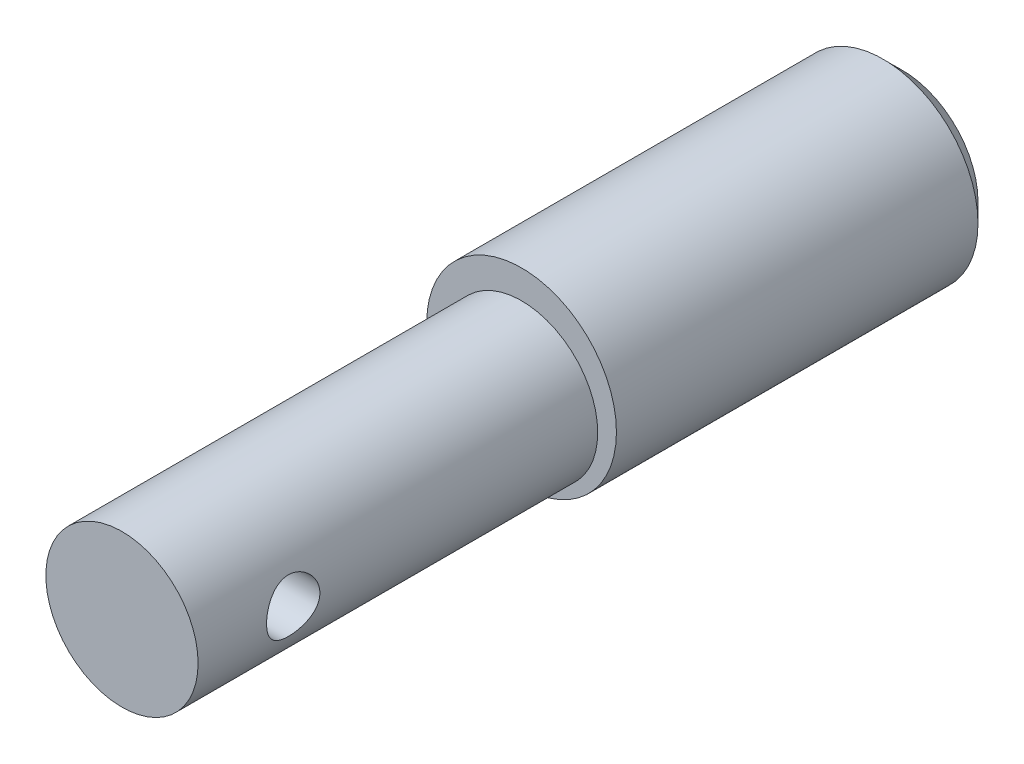
ISO-10303-21;
HEADER;
FILE_DESCRIPTION(('STEP AP214'),'2;1');
FILE_NAME('part.step','',(''),(''),'','','');
FILE_SCHEMA(('AUTOMOTIVE_DESIGN { 1 0 10303 214 1 1 1 1 }'));
ENDSEC;
DATA;
#1=APPLICATION_CONTEXT('core data for automotive mechanical design processes');
#2=APPLICATION_PROTOCOL_DEFINITION('international standard','automotive_design',2000,#1);
#3=PRODUCT_CONTEXT('',#1,'mechanical');
#4=PRODUCT('Part','Part','',(#3));
#5=PRODUCT_RELATED_PRODUCT_CATEGORY('part','',(#4));
#6=PRODUCT_DEFINITION_FORMATION('','',#4);
#7=PRODUCT_DEFINITION_CONTEXT('part definition',#1,'design');
#8=PRODUCT_DEFINITION('design','',#6,#7);
#9=PRODUCT_DEFINITION_SHAPE('','',#8);
#10=(LENGTH_UNIT() NAMED_UNIT(*) SI_UNIT(.MILLI.,.METRE.));
#11=(NAMED_UNIT(*) PLANE_ANGLE_UNIT() SI_UNIT($,.RADIAN.));
#12=(NAMED_UNIT(*) SI_UNIT($,.STERADIAN.) SOLID_ANGLE_UNIT());
#13=UNCERTAINTY_MEASURE_WITH_UNIT(LENGTH_MEASURE(1.E-05),#10,'distance_accuracy_value','');
#14=(GEOMETRIC_REPRESENTATION_CONTEXT(3) GLOBAL_UNCERTAINTY_ASSIGNED_CONTEXT((#13)) GLOBAL_UNIT_ASSIGNED_CONTEXT((#10,
#11,#12)) REPRESENTATION_CONTEXT('',''));
#15=CARTESIAN_POINT('',(0.,0.,0.));
#16=DIRECTION('',(0.,0.,1.));
#17=DIRECTION('',(1.,0.,0.));
#18=AXIS2_PLACEMENT_3D('',#15,#16,#17);
#19=CARTESIAN_POINT('',(0.,0.,16.271875));
#20=DIRECTION('',(0.,0.,-1.));
#21=DIRECTION('',(-1.,0.,0.));
#22=AXIS2_PLACEMENT_3D('',#19,#20,#21);
#23=CYLINDRICAL_SURFACE('',#22,3.95605);
#24=CARTESIAN_POINT('',(0.,0.,-0.396874999999998));
#25=DIRECTION('',(0.,0.,-1.));
#26=DIRECTION('',(-1.,0.,0.));
#27=AXIS2_PLACEMENT_3D('',#24,#25,#26);
#28=CIRCLE('',#27,3.95605);
#29=CARTESIAN_POINT('',(-3.95605,0.,-0.396874999999998));
#30=VERTEX_POINT('',#29);
#31=EDGE_CURVE('E49',#30,#30,#28,.T.);
#32=ORIENTED_EDGE('',*,*,#31,.T.);
#33=EDGE_LOOP('',(#32));
#34=FACE_BOUND('',#33,.T.);
#35=CARTESIAN_POINT('',(0.,0.,-15.478125));
#36=DIRECTION('',(0.,0.,1.));
#37=DIRECTION('',(1.,0.,0.));
#38=AXIS2_PLACEMENT_3D('',#35,#36,#37);
#39=CIRCLE('',#38,3.95605);
#40=CARTESIAN_POINT('',(3.95605,0.,-15.478125));
#41=VERTEX_POINT('',#40);
#42=EDGE_CURVE('E44',#41,#41,#39,.T.);
#43=ORIENTED_EDGE('',*,*,#42,.T.);
#44=EDGE_LOOP('',(#43));
#45=FACE_BOUND('',#44,.T.);
#46=ADVANCED_FACE('F31',(#34,#45),#23,.T.);
#47=CARTESIAN_POINT('',(0.,0.,-16.271875));
#48=DIRECTION('',(0.,0.,1.));
#49=DIRECTION('',(1.,0.,0.));
#50=AXIS2_PLACEMENT_3D('',#47,#48,#49);
#51=PLANE('',#50);
#52=CARTESIAN_POINT('',(0.,0.,-16.271875));
#53=DIRECTION('',(0.,0.,1.));
#54=DIRECTION('',(1.,0.,0.));
#55=AXIS2_PLACEMENT_3D('',#52,#53,#54);
#56=CIRCLE('',#55,3.16229999999999);
#57=CARTESIAN_POINT('',(3.16229999999999,0.,-16.271875));
#58=VERTEX_POINT('',#57);
#59=EDGE_CURVE('E11',#58,#58,#56,.F.);
#60=ORIENTED_EDGE('',*,*,#59,.T.);
#61=EDGE_LOOP('',(#60));
#62=FACE_BOUND('',#61,.T.);
#63=ADVANCED_FACE('F77',(#62),#51,.F.);
#64=CARTESIAN_POINT('',(0.,0.,-15.478125));
#65=DIRECTION('',(0.,0.,1.));
#66=DIRECTION('',(1.,0.,0.));
#67=AXIS2_PLACEMENT_3D('',#64,#65,#66);
#68=CONICAL_SURFACE('',#67,3.95605,0.785398163397446);
#69=ORIENTED_EDGE('',*,*,#59,.F.);
#70=EDGE_LOOP('',(#69));
#71=FACE_BOUND('',#70,.T.);
#72=ORIENTED_EDGE('',*,*,#42,.F.);
#73=EDGE_LOOP('',(#72));
#74=FACE_BOUND('',#73,.T.);
#75=ADVANCED_FACE('F33',(#71,#74),#68,.T.);
#76=CARTESIAN_POINT('',(0.,3.95605,-0.396874999999998));
#77=DIRECTION('',(0.,0.,-1.));
#78=DIRECTION('',(-1.,0.,0.));
#79=AXIS2_PLACEMENT_3D('',#76,#77,#78);
#80=PLANE('',#79);
#81=CARTESIAN_POINT('',(0.,-0.4064,-0.396874999999998));
#82=DIRECTION('',(0.,0.,1.));
#83=DIRECTION('',(1.,0.,0.));
#84=AXIS2_PLACEMENT_3D('',#81,#82,#83);
#85=CIRCLE('',#84,3.175);
#86=CARTESIAN_POINT('',(3.175,-0.4064,-0.396874999999998));
#87=VERTEX_POINT('',#86);
#88=EDGE_CURVE('E54',#87,#87,#85,.T.);
#89=ORIENTED_EDGE('',*,*,#88,.F.);
#90=EDGE_LOOP('',(#89));
#91=FACE_BOUND('',#90,.T.);
#92=ORIENTED_EDGE('',*,*,#31,.F.);
#93=EDGE_LOOP('',(#92));
#94=FACE_BOUND('',#93,.T.);
#95=ADVANCED_FACE('F84',(#91,#94),#80,.F.);
#96=CARTESIAN_POINT('',(0.,-0.4064,13.5155963302752));
#97=DIRECTION('',(0.,0.,1.));
#98=DIRECTION('',(1.,0.,0.));
#99=AXIS2_PLACEMENT_3D('',#96,#97,#98);
#100=CYLINDRICAL_SURFACE('',#99,3.175);
#101=CARTESIAN_POINT('',(3.175,-0.4064,11.1909716417267));
#102=CARTESIAN_POINT('',(3.17500066853554,-0.345895763126236,11.1909706900301));
#103=CARTESIAN_POINT('',(3.17325490135773,-0.285398321888288,11.1959248811373));
#104=CARTESIAN_POINT('',(3.16646357858772,-0.166195926056532,11.215542493183));
#105=CARTESIAN_POINT('',(3.16141801387547,-0.107490976417313,11.2302059409562));
#106=CARTESIAN_POINT('',(3.14857274998259,0.00639074221651198,11.2686703812459));
#107=CARTESIAN_POINT('',(3.14077794084885,0.0615735714813315,11.2924551562864));
#108=CARTESIAN_POINT('',(3.12322210927018,0.167165373662441,11.3484101495663));
#109=CARTESIAN_POINT('',(3.11346063901496,0.217573255469254,11.3805822781041));
#110=CARTESIAN_POINT('',(3.09257883886372,0.314088299969572,11.4536723473957));
#111=CARTESIAN_POINT('',(3.08142355594737,0.359990565416863,11.4948507950993));
#112=CARTESIAN_POINT('',(3.05919544932418,0.44439780767221,11.5842311932265));
#113=CARTESIAN_POINT('',(3.04812264708195,0.482900919429806,11.6324349090882));
#114=CARTESIAN_POINT('',(3.02692009281902,0.552638139965951,11.7364037014277));
#115=CARTESIAN_POINT('',(3.01683242462925,0.583596871413518,11.7923629101067));
#116=CARTESIAN_POINT('',(2.99927864989514,0.635574472042116,11.9091037837688));
#117=CARTESIAN_POINT('',(2.99181164748126,0.656596738838185,11.969883792043));
#118=CARTESIAN_POINT('',(2.98071488097154,0.687319986238264,12.0921981014418));
#119=CARTESIAN_POINT('',(2.9769544277741,0.697407904602637,12.1536229833421));
#120=CARTESIAN_POINT('',(2.97331146441449,0.707186018541611,12.2773998472565));
#121=CARTESIAN_POINT('',(2.97342760400117,0.706879834472287,12.3397514989052));
#122=CARTESIAN_POINT('',(2.97741089672416,0.696177037032629,12.4602211602447));
#123=CARTESIAN_POINT('',(2.98108587213659,0.68629737581093,12.5183925832644));
#124=CARTESIAN_POINT('',(2.99145635682566,0.65757583344791,12.6321928262602));
#125=CARTESIAN_POINT('',(2.99815226346194,0.638732773283885,12.6878213106893));
#126=CARTESIAN_POINT('',(3.01393852560689,0.592302934003713,12.7960829672324));
#127=CARTESIAN_POINT('',(3.02306827229197,0.564570635732072,12.8486477368331));
#128=CARTESIAN_POINT('',(3.04267834881712,0.501250647877553,12.948535696851));
#129=CARTESIAN_POINT('',(3.05315909994304,0.465660505492699,12.9958572436703));
#130=CARTESIAN_POINT('',(3.07503338749543,0.385198701663441,13.08680395219));
#131=CARTESIAN_POINT('',(3.08644459536056,0.339908218982322,13.1300551444113));
#132=CARTESIAN_POINT('',(3.10836554797923,0.242579309556115,13.2084514999779));
#133=CARTESIAN_POINT('',(3.1188751871888,0.190540094543227,13.2435957150747));
#134=CARTESIAN_POINT('',(3.13797296868932,0.0803348976351502,13.3051242062232));
#135=CARTESIAN_POINT('',(3.14653664188425,0.022103117811116,13.331398754021));
#136=CARTESIAN_POINT('',(3.16059865243742,-0.0983269943240249,13.3736594760205));
#137=CARTESIAN_POINT('',(3.16609817064702,-0.160523788302149,13.3896496139525));
#138=CARTESIAN_POINT('',(3.17321186973405,-0.283959706274182,13.4102029988529));
#139=CARTESIAN_POINT('',(3.17499748738957,-0.345105027988882,13.4152708581246));
#140=CARTESIAN_POINT('',(3.17500250538262,-0.467390549143685,13.4152858377261));
#141=CARTESIAN_POINT('',(3.17322257982571,-0.528530747366948,13.4102348711324));
#142=CARTESIAN_POINT('',(3.16640981372192,-0.646987696592213,13.3905491367241));
#143=CARTESIAN_POINT('',(3.1614849432552,-0.704364112994765,13.3762322671257));
#144=CARTESIAN_POINT('',(3.14898536881507,-0.81587100174808,13.338826858442));
#145=CARTESIAN_POINT('',(3.14141032192249,-0.870001052973602,13.3157371841677));
#146=CARTESIAN_POINT('',(3.12411016758225,-0.975153169767657,13.260738130984));
#147=CARTESIAN_POINT('',(3.11433132147319,-1.0260476310071,13.228602187825));
#148=CARTESIAN_POINT('',(3.09372246779125,-1.12188088429613,13.1566846916302));
#149=CARTESIAN_POINT('',(3.08289211132446,-1.16681768779956,13.1169005965967));
#150=CARTESIAN_POINT('',(3.0607046715305,-1.25182272642341,13.0284484672836));
#151=CARTESIAN_POINT('',(3.04934856120297,-1.29153128610349,12.979433661147));
#152=CARTESIAN_POINT('',(3.02793851171742,-1.36221462120816,12.8751987063955));
#153=CARTESIAN_POINT('',(3.0178846189315,-1.39318908565692,12.8199783369305));
#154=CARTESIAN_POINT('',(3.00029780510211,-1.44543921693908,12.7047269191665));
#155=CARTESIAN_POINT('',(2.99276503545936,-1.46671430132451,12.6446955822233));
#156=CARTESIAN_POINT('',(2.98122687812283,-1.49874001613804,12.5215720633924));
#157=CARTESIAN_POINT('',(2.97721967664465,-1.5094960585721,12.4584814730346));
#158=CARTESIAN_POINT('',(2.97340669260579,-1.51973035927989,12.334870459797));
#159=CARTESIAN_POINT('',(2.97337616249277,-1.51981190418432,12.274406417344));
#160=CARTESIAN_POINT('',(2.97695615008998,-1.51020377542791,12.1543752771751));
#161=CARTESIAN_POINT('',(2.9805664053649,-1.50051480604585,12.0948081151244));
#162=CARTESIAN_POINT('',(2.99084566705829,-1.47208569244129,11.9796486931689));
#163=CARTESIAN_POINT('',(2.99744178065524,-1.45356071103845,11.9239962819901));
#164=CARTESIAN_POINT('',(3.01291616766091,-1.40816518651889,11.816549936961));
#165=CARTESIAN_POINT('',(3.02179497852811,-1.3812926776756,11.7647569155089));
#166=CARTESIAN_POINT('',(3.04135727397725,-1.31848553415742,11.6638423998575));
#167=CARTESIAN_POINT('',(3.05210623299341,-1.28218253225696,11.6149629710793));
#168=CARTESIAN_POINT('',(3.07394393087423,-1.20214652478776,11.5237956382067));
#169=CARTESIAN_POINT('',(3.08503276970162,-1.15841131579318,11.4815096960327));
#170=CARTESIAN_POINT('',(3.10689632229082,-1.0624079892394,11.4028142873037));
#171=CARTESIAN_POINT('',(3.11763481297089,-1.00984574836619,11.3667521766732));
#172=CARTESIAN_POINT('',(3.13705096151443,-0.899040865032784,11.3040044738921));
#173=CARTESIAN_POINT('',(3.14572888770729,-0.840798963580377,11.2773176606607));
#174=CARTESIAN_POINT('',(3.15995884246808,-0.720868654991151,11.2344782048477));
#175=CARTESIAN_POINT('',(3.16554201769859,-0.659221721814062,11.2182203300356));
#176=CARTESIAN_POINT('',(3.17306159961663,-0.533846850693776,11.1964694530537));
#177=CARTESIAN_POINT('',(3.174999295936,-0.470119656787345,11.190972644));
#178=CARTESIAN_POINT('',(3.175,-0.4064,11.1909716417267));
#179=B_SPLINE_CURVE_WITH_KNOTS('',3,(#101,#102,#103,#104,#105,#106,#107,#108,#109,#110,#111,
#112,#113,#114,#115,#116,#117,#118,#119,#120,#121,#122,#123,#124,#125,#126,#127,#128,#129,#130,
#131,#132,#133,#134,#135,#136,#137,#138,#139,#140,#141,#142,#143,#144,#145,#146,#147,#148,#149,
#150,#151,#152,#153,#154,#155,#156,#157,#158,#159,#160,#161,#162,#163,#164,#165,#166,#167,#168,
#169,#170,#171,#172,#173,#174,#175,#176,#177,#178),.UNSPECIFIED.,.T.,.F.,(4,2,2,2,2,2,2,2,2,2,2,
2,2,2,2,2,2,2,2,2,2,2,2,2,2,2,2,2,2,2,2,2,2,2,2,2,2,2,4),(0.,0.181278002057098,
0.362556505135639,0.54351418308719,0.724513111908427,0.911675399146183,1.09888480130785,
1.29214909857678,1.48534726432088,1.67145977458031,1.85750746090272,2.03403833726646,
2.21059244047643,2.39019858108119,2.56986086465484,2.75995117641603,2.95006371120354,
3.14244865122902,3.33475939937204,3.51797588705833,3.70115773890124,3.87836604534698,
4.05559729012056,4.23773725061216,4.41993785351354,4.61132433125263,4.80271762241138,
4.99412240522798,5.18542865914298,5.3659179759329,5.54639428361107,5.72268428992002,
5.89901584158409,6.0836838265858,6.26840665591029,6.46139015996397,6.65434851965446,
6.84532788211838,7.03623967063121),.UNSPECIFIED.);
#180=CARTESIAN_POINT('',(3.175,-0.4064,11.1909716417267));
#181=VERTEX_POINT('',#180);
#182=EDGE_CURVE('E35',#181,#181,#179,.T.);
#183=ORIENTED_EDGE('',*,*,#182,.F.);
#184=EDGE_LOOP('',(#183));
#185=FACE_BOUND('',#184,.T.);
#186=CARTESIAN_POINT('',(-3.175,-0.4064,11.1909716417267));
#187=CARTESIAN_POINT('',(-3.17500066853554,-0.466904236873765,11.1909706900301));
#188=CARTESIAN_POINT('',(-3.17325490135773,-0.527401678111713,11.1959248811373));
#189=CARTESIAN_POINT('',(-3.16646357858772,-0.646604073943469,11.215542493183));
#190=CARTESIAN_POINT('',(-3.16141801387547,-0.705309023582687,11.2302059409562));
#191=CARTESIAN_POINT('',(-3.14857274998259,-0.819190742216513,11.2686703812459));
#192=CARTESIAN_POINT('',(-3.14077794084885,-0.874373571481332,11.2924551562864));
#193=CARTESIAN_POINT('',(-3.12322210927018,-0.979965373662442,11.3484101495663));
#194=CARTESIAN_POINT('',(-3.11346063901496,-1.03037325546925,11.3805822781041));
#195=CARTESIAN_POINT('',(-3.09257883886372,-1.12688829996957,11.4536723473957));
#196=CARTESIAN_POINT('',(-3.08142355594737,-1.17279056541686,11.4948507950993));
#197=CARTESIAN_POINT('',(-3.05919544932418,-1.25719780767221,11.5842311932265));
#198=CARTESIAN_POINT('',(-3.04812264708195,-1.29570091942981,11.6324349090882));
#199=CARTESIAN_POINT('',(-3.02692009281902,-1.36543813996595,11.7364037014277));
#200=CARTESIAN_POINT('',(-3.01683242462925,-1.39639687141352,11.7923629101067));
#201=CARTESIAN_POINT('',(-2.99927864989514,-1.44837447204212,11.9091037837688));
#202=CARTESIAN_POINT('',(-2.99181164748126,-1.46939673883819,11.969883792043));
#203=CARTESIAN_POINT('',(-2.98071488097154,-1.50011998623826,12.0921981014418));
#204=CARTESIAN_POINT('',(-2.9769544277741,-1.51020790460264,12.1536229833421));
#205=CARTESIAN_POINT('',(-2.97331146441449,-1.51998601854161,12.2773998472565));
#206=CARTESIAN_POINT('',(-2.97342760400117,-1.51967983447229,12.3397514989052));
#207=CARTESIAN_POINT('',(-2.97741089672416,-1.50897703703263,12.4602211602447));
#208=CARTESIAN_POINT('',(-2.98108587213659,-1.49909737581093,12.5183925832644));
#209=CARTESIAN_POINT('',(-2.99145635682566,-1.47037583344791,12.6321928262602));
#210=CARTESIAN_POINT('',(-2.99815226346194,-1.45153277328389,12.6878213106893));
#211=CARTESIAN_POINT('',(-3.01393852560689,-1.40510293400371,12.7960829672324));
#212=CARTESIAN_POINT('',(-3.02306827229197,-1.37737063573207,12.8486477368331));
#213=CARTESIAN_POINT('',(-3.04267834881712,-1.31405064787755,12.948535696851));
#214=CARTESIAN_POINT('',(-3.05315909994304,-1.2784605054927,12.9958572436703));
#215=CARTESIAN_POINT('',(-3.07503338749543,-1.19799870166344,13.08680395219));
#216=CARTESIAN_POINT('',(-3.08644459536056,-1.15270821898232,13.1300551444113));
#217=CARTESIAN_POINT('',(-3.10836554797923,-1.05537930955612,13.2084514999779));
#218=CARTESIAN_POINT('',(-3.1188751871888,-1.00334009454323,13.2435957150747));
#219=CARTESIAN_POINT('',(-3.13797296868932,-0.893134897635151,13.3051242062232));
#220=CARTESIAN_POINT('',(-3.14653664188425,-0.834903117811116,13.331398754021));
#221=CARTESIAN_POINT('',(-3.16059865243742,-0.714473005675975,13.3736594760205));
#222=CARTESIAN_POINT('',(-3.16609817064702,-0.652276211697851,13.3896496139525));
#223=CARTESIAN_POINT('',(-3.17321186973405,-0.528840293725818,13.4102029988529));
#224=CARTESIAN_POINT('',(-3.17499748738957,-0.467694972011118,13.4152708581246));
#225=CARTESIAN_POINT('',(-3.17500250538262,-0.345409450856315,13.4152858377261));
#226=CARTESIAN_POINT('',(-3.17322257982571,-0.284269252633053,13.4102348711324));
#227=CARTESIAN_POINT('',(-3.16640981372192,-0.165812303407788,13.3905491367241));
#228=CARTESIAN_POINT('',(-3.1614849432552,-0.108435887005236,13.3762322671257));
#229=CARTESIAN_POINT('',(-3.14898536881507,0.00307100174807962,13.338826858442));
#230=CARTESIAN_POINT('',(-3.14141032192249,0.0572010529736009,13.3157371841677));
#231=CARTESIAN_POINT('',(-3.12411016758225,0.162353169767657,13.260738130984));
#232=CARTESIAN_POINT('',(-3.11433132147319,0.213247631007104,13.228602187825));
#233=CARTESIAN_POINT('',(-3.09372246779125,0.309080884296133,13.1566846916302));
#234=CARTESIAN_POINT('',(-3.08289211132446,0.354017687799562,13.1169005965967));
#235=CARTESIAN_POINT('',(-3.0607046715305,0.439022726423405,13.0284484672836));
#236=CARTESIAN_POINT('',(-3.04934856120297,0.478731286103487,12.979433661147));
#237=CARTESIAN_POINT('',(-3.02793851171742,0.549414621208158,12.8751987063955));
#238=CARTESIAN_POINT('',(-3.0178846189315,0.580389085656915,12.8199783369305));
#239=CARTESIAN_POINT('',(-3.00029780510211,0.63263921693908,12.7047269191665));
#240=CARTESIAN_POINT('',(-2.99276503545936,0.653914301324509,12.6446955822233));
#241=CARTESIAN_POINT('',(-2.98122687812283,0.685940016138034,12.5215720633924));
#242=CARTESIAN_POINT('',(-2.97721967664465,0.696696058572104,12.4584814730346));
#243=CARTESIAN_POINT('',(-2.97340669260579,0.706930359279885,12.334870459797));
#244=CARTESIAN_POINT('',(-2.97337616249277,0.707011904184318,12.274406417344));
#245=CARTESIAN_POINT('',(-2.97695615008998,0.697403775427905,12.1543752771751));
#246=CARTESIAN_POINT('',(-2.9805664053649,0.687714806045851,12.0948081151244));
#247=CARTESIAN_POINT('',(-2.99084566705829,0.659285692441288,11.9796486931689));
#248=CARTESIAN_POINT('',(-2.99744178065524,0.64076071103845,11.9239962819901));
#249=CARTESIAN_POINT('',(-3.01291616766091,0.595365186518894,11.816549936961));
#250=CARTESIAN_POINT('',(-3.02179497852811,0.568492677675596,11.7647569155089));
#251=CARTESIAN_POINT('',(-3.04135727397725,0.50568553415742,11.6638423998575));
#252=CARTESIAN_POINT('',(-3.05210623299341,0.46938253225696,11.6149629710793));
#253=CARTESIAN_POINT('',(-3.07394393087423,0.38934652478776,11.5237956382067));
#254=CARTESIAN_POINT('',(-3.08503276970162,0.345611315793175,11.4815096960327));
#255=CARTESIAN_POINT('',(-3.10689632229082,0.2496079892394,11.4028142873037));
#256=CARTESIAN_POINT('',(-3.11763481297089,0.197045748366193,11.3667521766732));
#257=CARTESIAN_POINT('',(-3.13705096151443,0.0862408650327829,11.3040044738921));
#258=CARTESIAN_POINT('',(-3.14572888770729,0.0279989635803764,11.2773176606607));
#259=CARTESIAN_POINT('',(-3.15995884246808,-0.0919313450088493,11.2344782048477));
#260=CARTESIAN_POINT('',(-3.16554201769859,-0.153578278185939,11.2182203300356));
#261=CARTESIAN_POINT('',(-3.17306159961663,-0.278953149306225,11.1964694530537));
#262=CARTESIAN_POINT('',(-3.174999295936,-0.342680343212656,11.190972644));
#263=CARTESIAN_POINT('',(-3.175,-0.4064,11.1909716417267));
#264=B_SPLINE_CURVE_WITH_KNOTS('',3,(#186,#187,#188,#189,#190,#191,#192,#193,#194,#195,#196,
#197,#198,#199,#200,#201,#202,#203,#204,#205,#206,#207,#208,#209,#210,#211,#212,#213,#214,#215,
#216,#217,#218,#219,#220,#221,#222,#223,#224,#225,#226,#227,#228,#229,#230,#231,#232,#233,#234,
#235,#236,#237,#238,#239,#240,#241,#242,#243,#244,#245,#246,#247,#248,#249,#250,#251,#252,#253,
#254,#255,#256,#257,#258,#259,#260,#261,#262,#263),.UNSPECIFIED.,.T.,.F.,(4,2,2,2,2,2,2,2,2,2,2,
2,2,2,2,2,2,2,2,2,2,2,2,2,2,2,2,2,2,2,2,2,2,2,2,2,2,2,4),(0.,0.181278002057098,
0.362556505135639,0.54351418308719,0.724513111908427,0.911675399146183,1.09888480130785,
1.29214909857678,1.48534726432088,1.67145977458031,1.85750746090272,2.03403833726645,
2.21059244047643,2.39019858108119,2.56986086465484,2.75995117641603,2.95006371120354,
3.14244865122902,3.33475939937204,3.51797588705832,3.70115773890124,3.87836604534698,
4.05559729012056,4.23773725061216,4.41993785351354,4.61132433125263,4.80271762241138,
4.99412240522798,5.18542865914297,5.3659179759329,5.54639428361107,5.72268428992002,
5.89901584158409,6.0836838265858,6.26840665591029,6.46139015996396,6.65434851965446,
6.84532788211838,7.0362396706312),.UNSPECIFIED.);
#265=CARTESIAN_POINT('',(-3.175,-0.4064,11.1909716417267));
#266=VERTEX_POINT('',#265);
#267=EDGE_CURVE('E55',#266,#266,#264,.T.);
#268=ORIENTED_EDGE('',*,*,#267,.F.);
#269=EDGE_LOOP('',(#268));
#270=FACE_BOUND('',#269,.T.);
#271=ORIENTED_EDGE('',*,*,#88,.T.);
#272=EDGE_LOOP('',(#271));
#273=FACE_BOUND('',#272,.T.);
#274=CARTESIAN_POINT('',(0.,-0.4064,16.271875));
#275=DIRECTION('',(0.,0.,1.));
#276=DIRECTION('',(1.,0.,0.));
#277=AXIS2_PLACEMENT_3D('',#274,#275,#276);
#278=CIRCLE('',#277,3.175);
#279=CARTESIAN_POINT('',(3.175,-0.4064,16.271875));
#280=VERTEX_POINT('',#279);
#281=EDGE_CURVE('E98',#280,#280,#278,.T.);
#282=ORIENTED_EDGE('',*,*,#281,.F.);
#283=EDGE_LOOP('',(#282));
#284=FACE_BOUND('',#283,.T.);
#285=ADVANCED_FACE('F60',(#185,#270,#273,#284),#100,.T.);
#286=CARTESIAN_POINT('',(0.,0.,16.271875));
#287=DIRECTION('',(0.,0.,1.));
#288=DIRECTION('',(1.,0.,0.));
#289=AXIS2_PLACEMENT_3D('',#286,#287,#288);
#290=PLANE('',#289);
#291=ORIENTED_EDGE('',*,*,#281,.T.);
#292=EDGE_LOOP('',(#291));
#293=FACE_BOUND('',#292,.T.);
#294=ADVANCED_FACE('F66',(#293),#290,.T.);
#295=CARTESIAN_POINT('',(-3.95605,-0.4064,12.303125));
#296=DIRECTION('',(1.,0.,0.));
#297=DIRECTION('',(0.,0.,-1.));
#298=AXIS2_PLACEMENT_3D('',#295,#296,#297);
#299=CYLINDRICAL_SURFACE('',#298,1.11215335827328);
#300=ORIENTED_EDGE('',*,*,#182,.T.);
#301=EDGE_LOOP('',(#300));
#302=FACE_BOUND('',#301,.T.);
#303=ORIENTED_EDGE('',*,*,#267,.T.);
#304=EDGE_LOOP('',(#303));
#305=FACE_BOUND('',#304,.T.);
#306=ADVANCED_FACE('F63',(#302,#305),#299,.F.);
#307=CLOSED_SHELL('',(#46,#63,#75,#95,#285,#294,#306));
#308=MANIFOLD_SOLID_BREP('B2',#307);
#309=ADVANCED_BREP_SHAPE_REPRESENTATION('',(#18,#308),#14);
#310=SHAPE_DEFINITION_REPRESENTATION(#9,#309);
ENDSEC;
END-ISO-10303-21;
